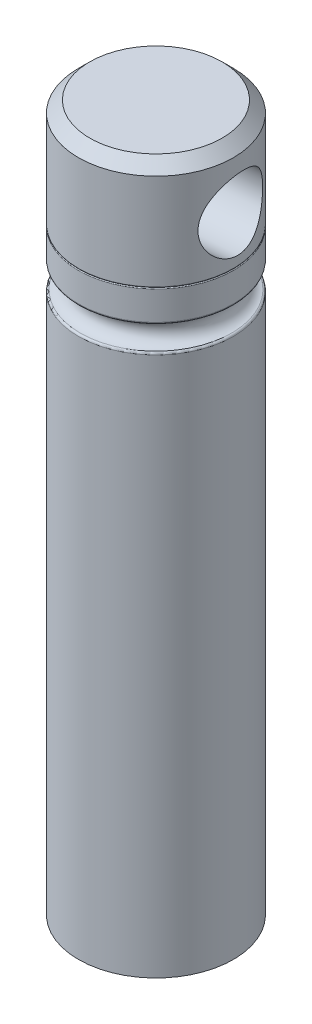
ISO-10303-21;
HEADER;
FILE_DESCRIPTION(('STEP AP214'),'2;1');
FILE_NAME('part.step','',(''),(''),'','','');
FILE_SCHEMA(('AUTOMOTIVE_DESIGN { 1 0 10303 214 1 1 1 1 }'));
ENDSEC;
DATA;
#1=APPLICATION_CONTEXT('core data for automotive mechanical design processes');
#2=APPLICATION_PROTOCOL_DEFINITION('international standard','automotive_design',2000,#1);
#3=PRODUCT_CONTEXT('',#1,'mechanical');
#4=PRODUCT('Part','Part','',(#3));
#5=PRODUCT_RELATED_PRODUCT_CATEGORY('part','',(#4));
#6=PRODUCT_DEFINITION_FORMATION('','',#4);
#7=PRODUCT_DEFINITION_CONTEXT('part definition',#1,'design');
#8=PRODUCT_DEFINITION('design','',#6,#7);
#9=PRODUCT_DEFINITION_SHAPE('','',#8);
#10=(LENGTH_UNIT() NAMED_UNIT(*) SI_UNIT(.MILLI.,.METRE.));
#11=(NAMED_UNIT(*) PLANE_ANGLE_UNIT() SI_UNIT($,.RADIAN.));
#12=(NAMED_UNIT(*) SI_UNIT($,.STERADIAN.) SOLID_ANGLE_UNIT());
#13=UNCERTAINTY_MEASURE_WITH_UNIT(LENGTH_MEASURE(1.E-05),#10,'distance_accuracy_value','');
#14=(GEOMETRIC_REPRESENTATION_CONTEXT(3) GLOBAL_UNCERTAINTY_ASSIGNED_CONTEXT((#13)) GLOBAL_UNIT_ASSIGNED_CONTEXT((#10,
#11,#12)) REPRESENTATION_CONTEXT('',''));
#15=CARTESIAN_POINT('',(0.,0.,0.));
#16=DIRECTION('',(0.,0.,1.));
#17=DIRECTION('',(1.,0.,0.));
#18=AXIS2_PLACEMENT_3D('',#15,#16,#17);
#19=CARTESIAN_POINT('',(-44.632408621397,74.583941633646,75.137205398811));
#20=DIRECTION('',(0.,1.,0.));
#21=DIRECTION('',(0.,0.,1.));
#22=AXIS2_PLACEMENT_3D('',#19,#20,#21);
#23=CYLINDRICAL_SURFACE('',#22,14.2875);
#24=CARTESIAN_POINT('',(-44.632408621397,174.116129254239,75.137205398811));
#25=DIRECTION('',(0.,-1.,0.));
#26=DIRECTION('',(0.,0.,-1.));
#27=AXIS2_PLACEMENT_3D('',#24,#25,#26);
#28=CIRCLE('',#27,14.2875);
#29=CARTESIAN_POINT('',(-44.632408621397,174.116129254239,60.849705398811));
#30=VERTEX_POINT('',#29);
#31=EDGE_CURVE('E10',#30,#30,#28,.T.);
#32=ORIENTED_EDGE('',*,*,#31,.T.);
#33=EDGE_LOOP('',(#32));
#34=FACE_BOUND('',#33,.T.);
#35=CARTESIAN_POINT('',(-44.632408621397,74.583941633646,75.137205398811));
#36=DIRECTION('',(0.,1.,0.));
#37=DIRECTION('',(0.,0.,1.));
#38=AXIS2_PLACEMENT_3D('',#35,#36,#37);
#39=CIRCLE('',#38,14.2875);
#40=CARTESIAN_POINT('',(-44.632408621397,74.583941633646,89.424705398811));
#41=VERTEX_POINT('',#40);
#42=EDGE_CURVE('E157',#41,#41,#39,.T.);
#43=ORIENTED_EDGE('',*,*,#42,.T.);
#44=EDGE_LOOP('',(#43));
#45=FACE_BOUND('',#44,.T.);
#46=ADVANCED_FACE('F44',(#34,#45),#23,.T.);
#47=CARTESIAN_POINT('',(-30.344908621397,74.583941633646,75.137205398811));
#48=DIRECTION('',(0.,-1.,0.));
#49=DIRECTION('',(0.,0.,-1.));
#50=AXIS2_PLACEMENT_3D('',#47,#48,#49);
#51=PLANE('',#50);
#52=ORIENTED_EDGE('',*,*,#42,.F.);
#53=EDGE_LOOP('',(#52));
#54=FACE_BOUND('',#53,.T.);
#55=ADVANCED_FACE('F121',(#54),#51,.T.);
#56=CARTESIAN_POINT('',(-44.632408621397,204.758941633646,75.137205398811));
#57=DIRECTION('',(0.,1.,0.));
#58=DIRECTION('',(0.,0.,1.));
#59=AXIS2_PLACEMENT_3D('',#56,#57,#58);
#60=PLANE('',#59);
#61=CARTESIAN_POINT('',(-44.632408621397,204.758941633646,75.137205398811));
#62=DIRECTION('',(0.,1.,0.));
#63=DIRECTION('',(0.,0.,1.));
#64=AXIS2_PLACEMENT_3D('',#61,#62,#63);
#65=CIRCLE('',#64,12.2047);
#66=CARTESIAN_POINT('',(-44.632408621397,204.758941633646,62.932505398811));
#67=VERTEX_POINT('',#66);
#68=EDGE_CURVE('E71',#67,#67,#65,.T.);
#69=ORIENTED_EDGE('',*,*,#68,.T.);
#70=EDGE_LOOP('',(#69));
#71=FACE_BOUND('',#70,.T.);
#72=ADVANCED_FACE('F117',(#71),#60,.T.);
#73=CARTESIAN_POINT('',(-44.632408621397,74.583941633646,75.137205398811));
#74=DIRECTION('',(0.,1.,0.));
#75=DIRECTION('',(0.,0.,1.));
#76=AXIS2_PLACEMENT_3D('',#73,#74,#75);
#77=CYLINDRICAL_SURFACE('',#76,14.2875);
#78=CARTESIAN_POINT('',(-44.632408621397,202.676141633646,75.137205398811));
#79=DIRECTION('',(0.,1.,0.));
#80=DIRECTION('',(0.,0.,1.));
#81=AXIS2_PLACEMENT_3D('',#78,#79,#80);
#82=CIRCLE('',#81,14.2875);
#83=CARTESIAN_POINT('',(-44.632408621397,202.676141633646,60.849705398811));
#84=VERTEX_POINT('',#83);
#85=EDGE_CURVE('E70',#84,#84,#82,.F.);
#86=ORIENTED_EDGE('',*,*,#85,.T.);
#87=EDGE_LOOP('',(#86));
#88=FACE_BOUND('',#87,.T.);
#89=CARTESIAN_POINT('',(-57.8378321223061,193.163841633646,69.6829000890912));
#90=CARTESIAN_POINT('',(-57.8378335835206,192.991804531908,69.6829015806785));
#91=CARTESIAN_POINT('',(-57.8407663318358,192.819726553803,69.6899873856762));
#92=CARTESIAN_POINT('',(-57.8523836249683,192.476854181424,69.7182440022443));
#93=CARTESIAN_POINT('',(-57.8610714471332,192.306060574644,69.7394228394186));
#94=CARTESIAN_POINT('',(-57.8838722131254,191.96680564734,69.7956430102752));
#95=CARTESIAN_POINT('',(-57.8979953966299,191.798349354445,69.8307105124648));
#96=CARTESIAN_POINT('',(-57.9311227998924,191.46523301938,69.9142872033787));
#97=CARTESIAN_POINT('',(-57.950129101787,191.300574629335,69.9628021267116));
#98=CARTESIAN_POINT('',(-57.9922110213457,190.977000668519,70.0724486409913));
#99=CARTESIAN_POINT('',(-58.0152654029837,190.818060103419,70.133514661469));
#100=CARTESIAN_POINT('',(-58.0647132838279,190.5059207251,70.2678144625371));
#101=CARTESIAN_POINT('',(-58.0911080635049,190.352724143061,70.3410529125617));
#102=CARTESIAN_POINT('',(-58.1739958466926,189.90313953777,70.5780316757338));
#103=CARTESIAN_POINT('',(-58.2342424523975,189.616395726314,70.7591590920201));
#104=CARTESIAN_POINT('',(-58.3617363243774,189.056010043142,71.1762808118769));
#105=CARTESIAN_POINT('',(-58.4291810493789,188.784585263797,71.4151686797892));
#106=CARTESIAN_POINT('',(-58.5588758264525,188.282779949622,71.9344598785913));
#107=CARTESIAN_POINT('',(-58.6211236248826,188.052417172642,72.2148810756436));
#108=CARTESIAN_POINT('',(-58.7061157691024,187.736599881217,72.6696008435242));
#109=CARTESIAN_POINT('',(-58.7336284463258,187.634105539291,72.8314378869739));
#110=CARTESIAN_POINT('',(-58.7839601202564,187.442990884666,73.1637746709655));
#111=CARTESIAN_POINT('',(-58.8067810793209,187.354364775161,73.3342707524166));
#112=CARTESIAN_POINT('',(-58.8467654202131,187.191824494734,73.6827367525224));
#113=CARTESIAN_POINT('',(-58.86392979994,187.117907729792,73.86070534667));
#114=CARTESIAN_POINT('',(-58.8917733346369,186.985556364445,74.2228046990767));
#115=CARTESIAN_POINT('',(-58.9024530465349,186.92712043473,74.4069349267178));
#116=CARTESIAN_POINT('',(-58.9162250574596,186.829497475738,74.7684840403913));
#117=CARTESIAN_POINT('',(-58.9197396315263,186.789355281672,74.9456292163356));
#118=CARTESIAN_POINT('',(-58.9200656495892,186.723805932131,75.3026356358761));
#119=CARTESIAN_POINT('',(-58.9168773428789,186.698398228696,75.482496778213));
#120=CARTESIAN_POINT('',(-58.903588014353,186.662637959615,75.8433824130527));
#121=CARTESIAN_POINT('',(-58.8934898755271,186.652279120756,76.0244063891943));
#122=CARTESIAN_POINT('',(-58.8663698478936,186.646729222079,76.3861642872435));
#123=CARTESIAN_POINT('',(-58.8493482936756,186.651537429355,76.5668982227443));
#124=CARTESIAN_POINT('',(-58.8100612314926,186.675353773977,76.9134330882747));
#125=CARTESIAN_POINT('',(-58.788268638597,186.693300853208,77.0793618868896));
#126=CARTESIAN_POINT('',(-58.7391899117622,186.74198807467,77.4085666005077));
#127=CARTESIAN_POINT('',(-58.711901893005,186.772732610036,77.5718415844864));
#128=CARTESIAN_POINT('',(-58.6522768351667,186.846686758611,77.8945350378626));
#129=CARTESIAN_POINT('',(-58.6199415280958,186.889892100109,78.0539548086082));
#130=CARTESIAN_POINT('',(-58.550743470542,186.988373028096,78.36807095765));
#131=CARTESIAN_POINT('',(-58.5138789943433,187.043653221656,78.5227655073241));
#132=CARTESIAN_POINT('',(-58.435688680623,187.166691740752,78.8287367492457));
#133=CARTESIAN_POINT('',(-58.3943052767373,187.234621389959,78.979929887979));
#134=CARTESIAN_POINT('',(-58.3082654278906,187.381847987582,79.2757283059685));
#135=CARTESIAN_POINT('',(-58.2636077959404,187.461149068482,79.4203311649696));
#136=CARTESIAN_POINT('',(-58.12589924024,187.715259094766,79.8431586995966));
#137=CARTESIAN_POINT('',(-58.0290634300777,187.906350707055,80.1105895270472));
#138=CARTESIAN_POINT('',(-57.8241894071966,188.3442927162,80.6321657240858));
#139=CARTESIAN_POINT('',(-57.7158835220941,188.594429391578,80.8834259178644));
#140=CARTESIAN_POINT('',(-57.504682836917,189.1346340421,81.3421234424278));
#141=CARTESIAN_POINT('',(-57.401791032756,189.424723810957,81.5495366978661));
#142=CARTESIAN_POINT('',(-57.256752925189,189.891987193613,81.8282651970351));
#143=CARTESIAN_POINT('',(-57.2090232193611,190.05709976339,81.9173374754889));
#144=CARTESIAN_POINT('',(-57.1191293151585,190.395557294418,82.081498594936));
#145=CARTESIAN_POINT('',(-57.0769626418902,190.568898547884,82.1565936602912));
#146=CARTESIAN_POINT('',(-56.9995497897723,190.922623601752,82.2921039569544));
#147=CARTESIAN_POINT('',(-56.9643003548598,191.103004040518,82.3525260982562));
#148=CARTESIAN_POINT('',(-56.9019244185428,191.469552035492,82.4580937139798));
#149=CARTESIAN_POINT('',(-56.87479701738,191.65571894815,82.5032408806345));
#150=CARTESIAN_POINT('',(-56.8313286262123,192.018551402305,82.5749896569441));
#151=CARTESIAN_POINT('',(-56.8143456121743,192.194920585858,82.6027030633649));
#152=CARTESIAN_POINT('',(-56.7888191763928,192.549897735736,82.6441979661705));
#153=CARTESIAN_POINT('',(-56.7802753331049,192.728505589785,82.657980158433));
#154=CARTESIAN_POINT('',(-56.7719340297686,193.08638208868,82.6714367502891));
#155=CARTESIAN_POINT('',(-56.7721329716831,193.265650431334,82.6711169534654));
#156=CARTESIAN_POINT('',(-56.7812616899731,193.623378239922,82.6563876118696));
#157=CARTESIAN_POINT('',(-56.790191080925,193.801837741215,82.6419786890905));
#158=CARTESIAN_POINT('',(-56.8153594206304,194.141612096004,82.6010437922979));
#159=CARTESIAN_POINT('',(-56.8309249168937,194.303113044332,82.5756314515427));
#160=CARTESIAN_POINT('',(-56.8686714538393,194.623163545075,82.5133732985422));
#161=CARTESIAN_POINT('',(-56.8908547332962,194.781712079383,82.4765236169108));
#162=CARTESIAN_POINT('',(-56.9412223854179,195.094800776653,82.3917340791963));
#163=CARTESIAN_POINT('',(-56.9694057067348,195.24934163654,82.343796165904));
#164=CARTESIAN_POINT('',(-57.0310617745723,195.553648410593,82.2371946661077));
#165=CARTESIAN_POINT('',(-57.0645365676525,195.703412450205,82.178526928292));
#166=CARTESIAN_POINT('',(-57.1375848091394,196.004007010802,82.0479983201235));
#167=CARTESIAN_POINT('',(-57.1773651621583,196.15458123747,81.9756619156883));
#168=CARTESIAN_POINT('',(-57.2608644252122,196.448919629798,81.8202109309626));
#169=CARTESIAN_POINT('',(-57.3045846695242,196.592681463043,81.7370926950952));
#170=CARTESIAN_POINT('',(-57.4402291224257,197.012836744656,81.4721596887833));
#171=CARTESIAN_POINT('',(-57.5366717883352,197.278237128446,81.2747068305273));
#172=CARTESIAN_POINT('',(-57.6893156934361,197.662678193485,80.9395336699992));
#173=CARTESIAN_POINT('',(-57.7441454322665,197.793935422278,80.8147924418528));
#174=CARTESIAN_POINT('',(-57.8538181661762,198.045238925375,80.5544832954873));
#175=CARTESIAN_POINT('',(-57.9086611526138,198.165288485586,80.4189185723026));
#176=CARTESIAN_POINT('',(-58.0171798089791,198.393469926051,80.1375367351112));
#177=CARTESIAN_POINT('',(-58.0708547727583,198.501594749325,79.9917136329762));
#178=CARTESIAN_POINT('',(-58.175820753603,198.705039846081,79.690669771777));
#179=CARTESIAN_POINT('',(-58.2271127914883,198.800365636235,79.5354531036741));
#180=CARTESIAN_POINT('',(-58.3268272644429,198.978551463463,79.2144756762687));
#181=CARTESIAN_POINT('',(-58.3752073631627,199.061246332849,79.0486098863596));
#182=CARTESIAN_POINT('',(-58.4673155970253,199.211930836686,78.7091672912443));
#183=CARTESIAN_POINT('',(-58.5110457471899,199.279926854082,78.535593872691));
#184=CARTESIAN_POINT('',(-58.5928921675587,199.400490273929,78.1819516664487));
#185=CARTESIAN_POINT('',(-58.6310104956521,199.453063339125,78.0018852900739));
#186=CARTESIAN_POINT('',(-58.7008192715132,199.54216898757,77.6366128445968));
#187=CARTESIAN_POINT('',(-58.7325103245413,199.578703081595,77.4514072613259));
#188=CARTESIAN_POINT('',(-58.7865441321797,199.632971503016,77.0925392772916));
#189=CARTESIAN_POINT('',(-58.8094349846551,199.651985280956,76.9191518287436));
#190=CARTESIAN_POINT('',(-58.8488956951189,199.675835677963,76.5706935747965));
#191=CARTESIAN_POINT('',(-58.8654659117115,199.680673101435,76.3956228654759));
#192=CARTESIAN_POINT('',(-58.8921088285133,199.676114124352,76.0452124503254));
#193=CARTESIAN_POINT('',(-58.902182910567,199.666720752368,75.8698728096618));
#194=CARTESIAN_POINT('',(-58.9158436568524,199.633817955194,75.520271945583));
#195=CARTESIAN_POINT('',(-58.9194304137809,199.610308731709,75.3460107067942));
#196=CARTESIAN_POINT('',(-58.9202762045719,199.550932632595,75.0083520908988));
#197=CARTESIAN_POINT('',(-58.9178349956467,199.51572358548,74.8448390434646));
#198=CARTESIAN_POINT('',(-58.9075354821455,199.433116892394,74.5210433208895));
#199=CARTESIAN_POINT('',(-58.899675423142,199.385715302037,74.3607617092737));
#200=CARTESIAN_POINT('',(-58.8789459289298,199.279179554551,74.0445315896587));
#201=CARTESIAN_POINT('',(-58.8660777408554,199.220048320158,73.8885820132377));
#202=CARTESIAN_POINT('',(-58.8358312846104,199.090518918255,73.5818252268585));
#203=CARTESIAN_POINT('',(-58.818451293118,199.020116449546,73.4310200067876));
#204=CARTESIAN_POINT('',(-58.7788898327266,198.865154074854,73.1287224291574));
#205=CARTESIAN_POINT('',(-58.7565264431902,198.780097118692,72.9775087280326));
#206=CARTESIAN_POINT('',(-58.7082433354187,198.598859732904,72.6824354715889));
#207=CARTESIAN_POINT('',(-58.6823223971708,198.50267548911,72.5385784624783));
#208=CARTESIAN_POINT('',(-58.6277223622453,198.299803499766,72.2589866592912));
#209=CARTESIAN_POINT('',(-58.599042724934,198.193113695299,72.1232534657623));
#210=CARTESIAN_POINT('',(-58.5397721545509,197.969849415052,71.8606183445615));
#211=CARTESIAN_POINT('',(-58.5091811239219,197.853274434624,71.7337168683598));
#212=CARTESIAN_POINT('',(-58.4443673195201,197.600702965392,71.4791855816825));
#213=CARTESIAN_POINT('',(-58.4100545955714,197.463897570933,71.3523799112379));
#214=CARTESIAN_POINT('',(-58.3413849472956,197.180178337662,71.1107429303083));
#215=CARTESIAN_POINT('',(-58.3070280398366,197.033267625148,70.9959079438442));
#216=CARTESIAN_POINT('',(-58.2394048228284,196.729906516352,70.7788514379016));
#217=CARTESIAN_POINT('',(-58.2061397553679,196.573445797389,70.6766439416657));
#218=CARTESIAN_POINT('',(-58.1419532799225,196.252051277669,70.485862699987));
#219=CARTESIAN_POINT('',(-58.1110308255316,196.087121315881,70.3972828488594));
#220=CARTESIAN_POINT('',(-58.0524243869138,195.748131800084,70.2337934052012));
#221=CARTESIAN_POINT('',(-58.0247727934648,195.574002246199,70.1590169943737));
#222=CARTESIAN_POINT('',(-57.9742036578317,195.219271482031,70.0250342249092));
#223=CARTESIAN_POINT('',(-57.951283726616,195.038673591952,69.9658200047281));
#224=CARTESIAN_POINT('',(-57.9112318844911,194.672782710602,69.8638281577939));
#225=CARTESIAN_POINT('',(-57.8940848358583,194.487503390133,69.8210075025009));
#226=CARTESIAN_POINT('',(-57.8663127888874,194.113454348342,69.7522423660725));
#227=CARTESIAN_POINT('',(-57.8556829601853,193.924687319162,69.7262853852449));
#228=CARTESIAN_POINT('',(-57.844999703188,193.640157340234,69.7002793434819));
#229=CARTESIAN_POINT('',(-57.8423155088834,193.545038660207,69.6937655503592));
#230=CARTESIAN_POINT('',(-57.8387312805122,193.354564724143,69.6850754297004));
#231=CARTESIAN_POINT('',(-57.8378313122899,193.259209459505,69.682899262238));
#232=CARTESIAN_POINT('',(-57.8378321223061,193.163841633646,69.6829000890912));
#233=B_SPLINE_CURVE_WITH_KNOTS('',3,(#89,#90,#91,#92,#93,#94,#95,#96,#97,#98,#99,#100,#101,#102,
#103,#104,#105,#106,#107,#108,#109,#110,#111,#112,#113,#114,#115,#116,#117,#118,#119,#120,#121,
#122,#123,#124,#125,#126,#127,#128,#129,#130,#131,#132,#133,#134,#135,#136,#137,#138,#139,#140,
#141,#142,#143,#144,#145,#146,#147,#148,#149,#150,#151,#152,#153,#154,#155,#156,#157,#158,#159,
#160,#161,#162,#163,#164,#165,#166,#167,#168,#169,#170,#171,#172,#173,#174,#175,#176,#177,#178,
#179,#180,#181,#182,#183,#184,#185,#186,#187,#188,#189,#190,#191,#192,#193,#194,#195,#196,#197,
#198,#199,#200,#201,#202,#203,#204,#205,#206,#207,#208,#209,#210,#211,#212,#213,#214,#215,#216,
#217,#218,#219,#220,#221,#222,#223,#224,#225,#226,#227,#228,#229,#230,#231,#232),.UNSPECIFIED.,
.T.,.F.,(4,2,2,2,2,2,2,2,2,2,2,2,2,2,2,2,2,2,2,2,2,2,2,2,2,2,2,2,2,2,2,2,2,2,2,2,2,2,2,2,2,2,2,
2,2,2,2,2,2,2,2,2,2,2,2,2,2,2,2,2,2,2,2,2,2,2,2,2,2,2,2,4),(0.,0.516012682824647,
1.03231947280172,1.54960373248221,2.067108926628,2.58197628133222,3.09704160076474,
4.1260307715166,5.22499628330024,6.3244359114238,6.90439942647955,7.48411987034073,
8.06373798864627,8.64330632009817,9.1875963984953,9.73186623402012,10.2759091221602,
10.8199257213403,11.3242714470438,11.8287904484585,12.3331366999291,12.8376757181611,
13.3496240514666,13.8617589053068,14.8854117360487,15.9929604417471,17.1011157064754,
17.6812346000657,18.2610945325395,18.8406808567813,19.4202029507119,19.957489692651,
20.4947495952604,21.031788394079,21.5688034852964,22.0609261707134,22.5532155287976,
23.0454186971487,23.5378127006712,24.0524046120888,24.5671714540177,25.5962489477835,
26.163338062496,26.7302603903003,27.2975164387836,27.8645271968212,28.4384131924746,
29.0120494764613,29.5854748777464,30.1588462541186,30.6859360150565,31.2129958668721,
31.7399435665813,32.2668837367373,32.7681527737099,33.2695841796944,33.7708907980351,
34.2723891771822,34.7966177150047,35.3210264811847,35.8455382281511,36.3700767680715,
36.9384185596149,37.5065853063974,38.0753774551712,38.643914017361,39.2176780660231,
39.7911517070118,40.3631096478669,40.9346431569236,41.2206814080896,41.5067302148844),.UNSPECIFIED.);
#234=CARTESIAN_POINT('',(-57.8378321223061,193.163841633646,69.6829000890912));
#235=VERTEX_POINT('',#234);
#236=EDGE_CURVE('E76',#235,#235,#233,.T.);
#237=ORIENTED_EDGE('',*,*,#236,.F.);
#238=EDGE_LOOP('',(#237));
#239=FACE_BOUND('',#238,.T.);
#240=CARTESIAN_POINT('',(-32.4917010743628,193.163841633646,67.6048832796113));
#241=CARTESIAN_POINT('',(-32.4916993897163,193.335878735384,67.6048845132833));
#242=CARTESIAN_POINT('',(-32.4876516939644,193.507956713489,67.6113980226481));
#243=CARTESIAN_POINT('',(-32.4715871984371,193.850829085868,67.6373851322038));
#244=CARTESIAN_POINT('',(-32.4595658578974,194.021622692648,67.6568661170263));
#245=CARTESIAN_POINT('',(-32.4279126270021,194.360877619952,67.7086218463213));
#246=CARTESIAN_POINT('',(-32.4082663714743,194.529333912847,67.7409207420588));
#247=CARTESIAN_POINT('',(-32.3619686705474,194.862450247912,67.8179857211343));
#248=CARTESIAN_POINT('',(-32.3353142367836,195.027108637957,67.8627571233731));
#249=CARTESIAN_POINT('',(-32.2759354366066,195.350682598773,67.9640853234805));
#250=CARTESIAN_POINT('',(-32.2432427025216,195.509623163873,68.0205808853215));
#251=CARTESIAN_POINT('',(-32.172580865603,195.821762542192,68.1450334236251));
#252=CARTESIAN_POINT('',(-32.1346097388571,195.974959124231,68.2129947986101));
#253=CARTESIAN_POINT('',(-32.0142305670625,196.424543729522,68.4333086061538));
#254=CARTESIAN_POINT('',(-31.9252870960257,196.711287540978,68.6022045900889));
#255=CARTESIAN_POINT('',(-31.7315564595135,197.27167322415,68.9929905379495));
#256=CARTESIAN_POINT('',(-31.6261031789377,197.543098003495,69.217703265631));
#257=CARTESIAN_POINT('',(-31.4135600373618,198.04490331767,69.7089358961865));
#258=CARTESIAN_POINT('',(-31.3064694899345,198.27526609465,69.9754737937121));
#259=CARTESIAN_POINT('',(-31.1485492019622,198.591083386075,70.4102782492173));
#260=CARTESIAN_POINT('',(-31.0950444917792,198.693577728001,70.5654730365936));
#261=CARTESIAN_POINT('',(-30.9912551265207,198.884692382626,70.8851741205045));
#262=CARTESIAN_POINT('',(-30.9409691312714,198.973318492131,71.0496764871883));
#263=CARTESIAN_POINT('',(-30.8447618583345,199.135858772558,71.3869767412357));
#264=CARTESIAN_POINT('',(-30.798839811804,199.2097755375,71.5597731592447));
#265=CARTESIAN_POINT('',(-30.7123906723265,199.342126902847,71.9125021624771));
#266=CARTESIAN_POINT('',(-30.6718631163138,199.400562832561,72.0924341334578));
#267=CARTESIAN_POINT('',(-30.5993872172755,199.498185791554,72.4469121637243));
#268=CARTESIAN_POINT('',(-30.5670668189576,199.53832798562,72.6211193893029));
#269=CARTESIAN_POINT('',(-30.508597258963,199.603877335161,72.9733054203077));
#270=CARTESIAN_POINT('',(-30.4824478678146,199.629285038596,73.1512840852229));
#271=CARTESIAN_POINT('',(-30.4367800094245,199.665045307677,73.5095151480809));
#272=CARTESIAN_POINT('',(-30.417258781794,199.675404146536,73.6897665669869));
#273=CARTESIAN_POINT('',(-30.3850948631363,199.680954045213,74.0511109387936));
#274=CARTESIAN_POINT('',(-30.3724518397736,199.676145837937,74.2322038506093));
#275=CARTESIAN_POINT('',(-30.3547719547468,199.652329493315,74.5805101927115));
#276=CARTESIAN_POINT('',(-30.3492476663225,199.634382414084,74.7477727574183));
#277=CARTESIAN_POINT('',(-30.3440513644225,199.585695192622,75.0805751963257));
#278=CARTESIAN_POINT('',(-30.3443813622377,199.554950657256,75.2461144589263));
#279=CARTESIAN_POINT('',(-30.3506510910029,199.480996508681,75.5742103334436));
#280=CARTESIAN_POINT('',(-30.3565889011123,199.437791167183,75.7367679472273));
#281=CARTESIAN_POINT('',(-30.3737008363209,199.339310239196,76.0579602695694));
#282=CARTESIAN_POINT('',(-30.3848769619307,199.284030045636,76.2165934550024));
#283=CARTESIAN_POINT('',(-30.4121876877257,199.16099152654,76.531214258986));
#284=CARTESIAN_POINT('',(-30.4283926944518,199.093061877333,76.6871288159529));
#285=CARTESIAN_POINT('',(-30.4651050487751,198.94583527971,76.9929911423593));
#286=CARTESIAN_POINT('',(-30.4856139617132,198.86653419881,77.142936717195));
#287=CARTESIAN_POINT('',(-30.5526150280979,198.612424172526,77.5825474853241));
#288=CARTESIAN_POINT('',(-30.6045995888252,198.421332560237,77.8621794345837));
#289=CARTESIAN_POINT('',(-30.7217854080889,197.983390551092,78.4101598889178));
#290=CARTESIAN_POINT('',(-30.7877206914913,197.733253875714,78.6757053428954));
#291=CARTESIAN_POINT('',(-30.9213901373292,197.193049225192,79.1626772391166));
#292=CARTESIAN_POINT('',(-30.9891252651611,196.902959456335,79.3840794395406));
#293=CARTESIAN_POINT('',(-31.0868283302444,196.435696073679,79.6827092102751));
#294=CARTESIAN_POINT('',(-31.1194129112633,196.270583503902,79.7783661007075));
#295=CARTESIAN_POINT('',(-31.1813684558684,195.932125972874,79.9549766826203));
#296=CARTESIAN_POINT('',(-31.2107408474986,195.758784719408,80.0359369184472));
#297=CARTESIAN_POINT('',(-31.2650485467097,195.40505966554,80.1822463985952));
#298=CARTESIAN_POINT('',(-31.2899859413994,195.224679226774,80.247602990973));
#299=CARTESIAN_POINT('',(-31.334334474361,194.8581312318,80.3619204723358));
#300=CARTESIAN_POINT('',(-31.3537462247517,194.671964319142,80.4108831775058));
#301=CARTESIAN_POINT('',(-31.3849479830604,194.309131864987,80.4887538280172));
#302=CARTESIAN_POINT('',(-31.3971903563619,194.132762681434,80.5188632942564));
#303=CARTESIAN_POINT('',(-31.4156173872066,193.777785531556,80.5639617467442));
#304=CARTESIAN_POINT('',(-31.4218023473233,193.599177677507,80.5789514882378));
#305=CARTESIAN_POINT('',(-31.4278405047064,193.241301178612,80.5935869882685));
#306=CARTESIAN_POINT('',(-31.4276963066972,193.062032835958,80.5932390589252));
#307=CARTESIAN_POINT('',(-31.4210885499186,192.70430502737,80.5772195535701));
#308=CARTESIAN_POINT('',(-31.4146252701181,192.525845526077,80.5615486540221));
#309=CARTESIAN_POINT('',(-31.3964603417866,192.186071171288,80.5170610548773));
#310=CARTESIAN_POINT('',(-31.3852417682948,192.02457022296,80.489452807099));
#311=CARTESIAN_POINT('',(-31.3581396594903,191.704519722217,80.4218780014037));
#312=CARTESIAN_POINT('',(-31.3422545455299,191.54597118791,80.381907261127));
#313=CARTESIAN_POINT('',(-31.3063696869587,191.232882490639,80.290046262812));
#314=CARTESIAN_POINT('',(-31.2863706632221,191.078341630752,80.2381580928612));
#315=CARTESIAN_POINT('',(-31.2429007812143,190.774034856699,80.1229377829404));
#316=CARTESIAN_POINT('',(-31.2194285798627,190.624270817087,80.0596012137573));
#317=CARTESIAN_POINT('',(-31.1686158092822,190.32367625649,79.9189177908509));
#318=CARTESIAN_POINT('',(-31.1411485515895,190.173102029822,79.8410680532293));
#319=CARTESIAN_POINT('',(-31.0840835824668,189.878763637495,79.6740928308705));
#320=CARTESIAN_POINT('',(-31.0544851499838,189.735001804249,79.5849635220492));
#321=CARTESIAN_POINT('',(-30.9638033420801,189.314846522636,79.3014750299517));
#322=CARTESIAN_POINT('',(-30.9008089209447,189.049446138846,79.0909506324415));
#323=CARTESIAN_POINT('',(-30.8047951216948,188.665005073807,78.7353911301688));
#324=CARTESIAN_POINT('',(-30.7710149456399,188.533747845014,78.6033851683133));
#325=CARTESIAN_POINT('',(-30.7052049258442,188.282444341917,78.3286889696879));
#326=CARTESIAN_POINT('',(-30.6731745702343,188.162394781706,78.1860018866949));
#327=CARTESIAN_POINT('',(-30.6119354595457,187.934213341241,77.8907023634942));
#328=CARTESIAN_POINT('',(-30.5827283765103,187.826088517967,77.7380841301354));
#329=CARTESIAN_POINT('',(-30.5281969789746,187.622643421211,77.423963786663));
#330=CARTESIAN_POINT('',(-30.5028709909652,187.527317631057,77.2624655466146));
#331=CARTESIAN_POINT('',(-30.4567676813777,187.349131803829,76.9295331662947));
#332=CARTESIAN_POINT('',(-30.4360492378102,187.266436934443,76.7580022935328));
#333=CARTESIAN_POINT('',(-30.4004581360941,187.115752430606,76.4080901965677));
#334=CARTESIAN_POINT('',(-30.3855829382256,187.04775641321,76.2297119855943));
#335=CARTESIAN_POINT('',(-30.3624293993479,186.927192993363,75.8674612986377));
#336=CARTESIAN_POINT('',(-30.3541486351835,186.874619928167,75.6835908665877));
#337=CARTESIAN_POINT('',(-30.344766286721,186.785514279722,75.3118258922432));
#338=CARTESIAN_POINT('',(-30.3436640261144,186.748980185697,75.1239317307099));
#339=CARTESIAN_POINT('',(-30.3488028595421,186.694711764276,74.7610550647148));
#340=CARTESIAN_POINT('',(-30.3544583915325,186.675697986336,74.5862545687231));
#341=CARTESIAN_POINT('',(-30.3722802215386,186.651847589329,74.2360222389913));
#342=CARTESIAN_POINT('',(-30.3844461500899,186.647010165857,74.0605904416385));
#343=CARTESIAN_POINT('',(-30.4152325721064,186.65156914294,73.7105197340934));
#344=CARTESIAN_POINT('',(-30.4338516915655,186.660962514924,73.5358806631275));
#345=CARTESIAN_POINT('',(-30.477315069879,186.693865312098,73.1887231845976));
#346=CARTESIAN_POINT('',(-30.5021592397787,186.717374535583,73.0162047467671));
#347=CARTESIAN_POINT('',(-30.5563213394256,186.776750634697,72.6829172984401));
#348=CARTESIAN_POINT('',(-30.5853623547291,186.811959681812,72.5219853388659));
#349=CARTESIAN_POINT('',(-30.6482629925757,186.894566374898,72.2041909718693));
#350=CARTESIAN_POINT('',(-30.6821241728953,186.941967965255,72.0473298995249));
#351=CARTESIAN_POINT('',(-30.7540832569822,187.048503712741,71.7386989051329));
#352=CARTESIAN_POINT('',(-30.7921801042894,187.107634947134,71.5869277258021));
#353=CARTESIAN_POINT('',(-30.8719860838343,187.237164349037,71.2891936502683));
#354=CARTESIAN_POINT('',(-30.9136965922759,187.307566817746,71.143232998069));
#355=CARTESIAN_POINT('',(-31.0019668884332,187.462529192438,70.8514157788963));
#356=CARTESIAN_POINT('',(-31.0486607809705,187.5475861486,70.7058637778824));
#357=CARTESIAN_POINT('',(-31.1443595890021,187.728823534388,70.4225949597861));
#358=CARTESIAN_POINT('',(-31.1933652935008,187.825007778182,70.2848808536224));
#359=CARTESIAN_POINT('',(-31.292775113262,188.027879767526,70.017915634992));
#360=CARTESIAN_POINT('',(-31.3431795012475,188.134569571993,69.8886661897566));
#361=CARTESIAN_POINT('',(-31.4444356463043,188.35783385224,69.6391919416067));
#362=CARTESIAN_POINT('',(-31.4952874260963,188.474408832668,69.5189676000235));
#363=CARTESIAN_POINT('',(-31.6006928607282,188.7269803019,69.2783918333955));
#364=CARTESIAN_POINT('',(-31.6552010316899,188.863785696359,69.1588681939759));
#365=CARTESIAN_POINT('',(-31.762310643957,189.14750492963,68.9316425745861));
#366=CARTESIAN_POINT('',(-31.8149126673494,189.294415642144,68.8239369649764));
#367=CARTESIAN_POINT('',(-31.91698624432,189.597776750941,68.6207931461314));
#368=CARTESIAN_POINT('',(-31.9664542883416,189.754237469903,68.5253685705723));
#369=CARTESIAN_POINT('',(-32.0608573976896,190.075631989623,68.3475893851989));
#370=CARTESIAN_POINT('',(-32.1057944899204,190.240561951411,68.265228921667));
#371=CARTESIAN_POINT('',(-32.1902468876027,190.579551467208,68.113468237164));
#372=CARTESIAN_POINT('',(-32.2297085426597,190.753681021093,68.044194143762));
#373=CARTESIAN_POINT('',(-32.3014250247389,191.108411785261,67.9202370294432));
#374=CARTESIAN_POINT('',(-32.3336834893501,191.28900967534,67.8655466410781));
#375=CARTESIAN_POINT('',(-32.3898125566226,191.65490055669,67.7714402400963));
#376=CARTESIAN_POINT('',(-32.4137051031965,191.840179877159,67.7319842390983));
#377=CARTESIAN_POINT('',(-32.4523065089856,192.21422891895,67.6686607675251));
#378=CARTESIAN_POINT('',(-32.4670221699662,192.40299594813,67.6447817509242));
#379=CARTESIAN_POINT('',(-32.4817985366521,192.687525927058,67.6208630307283));
#380=CARTESIAN_POINT('',(-32.4855078302663,192.782644607085,67.6148734113086));
#381=CARTESIAN_POINT('',(-32.4904596115775,192.973118543149,67.6068831202045));
#382=CARTESIAN_POINT('',(-32.4917020082373,193.068473807787,67.6048825957319));
#383=CARTESIAN_POINT('',(-32.4917010743628,193.163841633646,67.6048832796113));
#384=B_SPLINE_CURVE_WITH_KNOTS('',3,(#240,#241,#242,#243,#244,#245,#246,#247,#248,#249,#250,
#251,#252,#253,#254,#255,#256,#257,#258,#259,#260,#261,#262,#263,#264,#265,#266,#267,#268,#269,
#270,#271,#272,#273,#274,#275,#276,#277,#278,#279,#280,#281,#282,#283,#284,#285,#286,#287,#288,
#289,#290,#291,#292,#293,#294,#295,#296,#297,#298,#299,#300,#301,#302,#303,#304,#305,#306,#307,
#308,#309,#310,#311,#312,#313,#314,#315,#316,#317,#318,#319,#320,#321,#322,#323,#324,#325,#326,
#327,#328,#329,#330,#331,#332,#333,#334,#335,#336,#337,#338,#339,#340,#341,#342,#343,#344,#345,
#346,#347,#348,#349,#350,#351,#352,#353,#354,#355,#356,#357,#358,#359,#360,#361,#362,#363,#364,
#365,#366,#367,#368,#369,#370,#371,#372,#373,#374,#375,#376,#377,#378,#379,#380,#381,#382,#383),
.UNSPECIFIED.,.T.,.F.,(4,2,2,2,2,2,2,2,2,2,2,2,2,2,2,2,2,2,2,2,2,2,2,2,2,2,2,2,2,2,2,2,2,2,2,2,
2,2,2,2,2,2,2,2,2,2,2,2,2,2,2,2,2,2,2,2,2,2,2,2,2,2,2,2,2,2,2,2,2,2,2,4),(0.,0.516012682824646,
1.03231947280172,1.54960373248221,2.067108926628,2.58197628133222,3.09704160076474,
4.12603077151659,5.22499628330022,6.3244359114238,6.90439942647954,7.48411987034072,
8.06373798864628,8.64330632009815,9.1875963984953,9.73186623402009,10.2759091221602,
10.8199257213403,11.3242714470438,11.8287904484585,12.3331366999291,12.8376757181611,
13.3496240514666,13.8617589053068,14.8854117360487,15.9929604417471,17.1011157064754,
17.6812346000657,18.2610945325395,18.8406808567813,19.4202029507119,19.957489692651,
20.4947495952604,21.031788394079,21.5688034852964,22.0609261707134,22.5532155287975,
23.0454186971487,23.5378127006712,24.0524046120888,24.5671714540176,25.5962489477835,
26.163338062496,26.7302603903003,27.2975164387836,27.8645271968212,28.4384131924747,
29.0120494764613,29.5854748777464,30.1588462541185,30.6859360150565,31.2129958668721,
31.7399435665812,32.2668837367373,32.76815277371,33.2695841796944,33.7708907980351,
34.2723891771822,34.7966177150047,35.3210264811847,35.8455382281511,36.3700767680714,
36.9384185596149,37.5065853063974,38.0753774551712,38.643914017361,39.2176780660231,
39.7911517070118,40.3631096478669,40.9346431569236,41.2206814080896,41.5067302148844),.UNSPECIFIED.);
#385=CARTESIAN_POINT('',(-32.4917010743628,193.163841633646,67.6048832796113));
#386=VERTEX_POINT('',#385);
#387=EDGE_CURVE('E80',#386,#386,#384,.T.);
#388=ORIENTED_EDGE('',*,*,#387,.F.);
#389=EDGE_LOOP('',(#388));
#390=FACE_BOUND('',#389,.T.);
#391=CARTESIAN_POINT('',(-44.632408621397,184.997741633646,75.137205398811));
#392=DIRECTION('',(0.,1.,0.));
#393=DIRECTION('',(0.,0.,1.));
#394=AXIS2_PLACEMENT_3D('',#391,#392,#393);
#395=CIRCLE('',#394,14.2875);
#396=CARTESIAN_POINT('',(-44.632408621397,184.997741633646,89.424705398811));
#397=VERTEX_POINT('',#396);
#398=EDGE_CURVE('E152',#397,#397,#395,.T.);
#399=ORIENTED_EDGE('',*,*,#398,.T.);
#400=EDGE_LOOP('',(#399));
#401=FACE_BOUND('',#400,.T.);
#402=ADVANCED_FACE('F95',(#88,#239,#390,#401),#77,.T.);
#403=CARTESIAN_POINT('',(-44.632408621397,184.997741633646,75.137205398811));
#404=DIRECTION('',(0.,1.,0.));
#405=DIRECTION('',(0.,0.,1.));
#406=AXIS2_PLACEMENT_3D('',#403,#404,#405);
#407=TOROIDAL_SURFACE('',#406,14.1097,0.177800000000002);
#408=CARTESIAN_POINT('',(-44.632408621397,184.819941633646,75.137205398811));
#409=DIRECTION('',(0.,1.,0.));
#410=DIRECTION('',(0.,0.,1.));
#411=AXIS2_PLACEMENT_3D('',#408,#409,#410);
#412=CIRCLE('',#411,14.1097);
#413=CARTESIAN_POINT('',(-44.632408621397,184.819941633646,89.246905398811));
#414=VERTEX_POINT('',#413);
#415=EDGE_CURVE('E151',#414,#414,#412,.T.);
#416=ORIENTED_EDGE('',*,*,#415,.T.);
#417=EDGE_LOOP('',(#416));
#418=FACE_BOUND('',#417,.T.);
#419=ORIENTED_EDGE('',*,*,#398,.F.);
#420=EDGE_LOOP('',(#419));
#421=FACE_BOUND('',#420,.T.);
#422=ADVANCED_FACE('F115',(#418,#421),#407,.T.);
#423=CARTESIAN_POINT('',(-44.632408621397,184.642141633646,75.137205398811));
#424=DIRECTION('',(0.,1.,0.));
#425=DIRECTION('',(0.,0.,1.));
#426=AXIS2_PLACEMENT_3D('',#423,#424,#425);
#427=TOROIDAL_SURFACE('',#426,14.1097,0.177800000000002);
#428=CARTESIAN_POINT('',(-44.632408621397,184.642141633646,75.137205398811));
#429=DIRECTION('',(0.,1.,0.));
#430=DIRECTION('',(0.,0.,1.));
#431=AXIS2_PLACEMENT_3D('',#428,#429,#430);
#432=CIRCLE('',#431,14.2875);
#433=CARTESIAN_POINT('',(-44.632408621397,184.642141633646,89.424705398811));
#434=VERTEX_POINT('',#433);
#435=EDGE_CURVE('E87',#434,#434,#432,.T.);
#436=ORIENTED_EDGE('',*,*,#435,.T.);
#437=EDGE_LOOP('',(#436));
#438=FACE_BOUND('',#437,.T.);
#439=ORIENTED_EDGE('',*,*,#415,.F.);
#440=EDGE_LOOP('',(#439));
#441=FACE_BOUND('',#440,.T.);
#442=ADVANCED_FACE('F108',(#438,#441),#427,.T.);
#443=CARTESIAN_POINT('',(-44.632408621397,74.583941633646,75.137205398811));
#444=DIRECTION('',(0.,1.,0.));
#445=DIRECTION('',(0.,0.,1.));
#446=AXIS2_PLACEMENT_3D('',#443,#444,#445);
#447=CYLINDRICAL_SURFACE('',#446,14.2875);
#448=CARTESIAN_POINT('',(-44.632408621397,179.331254013053,75.137205398811));
#449=DIRECTION('',(0.,-1.,0.));
#450=DIRECTION('',(0.,0.,-1.));
#451=AXIS2_PLACEMENT_3D('',#448,#449,#450);
#452=CIRCLE('',#451,14.2875);
#453=CARTESIAN_POINT('',(-44.632408621397,179.331254013053,60.849705398811));
#454=VERTEX_POINT('',#453);
#455=EDGE_CURVE('E61',#454,#454,#452,.F.);
#456=ORIENTED_EDGE('',*,*,#455,.T.);
#457=EDGE_LOOP('',(#456));
#458=FACE_BOUND('',#457,.T.);
#459=ORIENTED_EDGE('',*,*,#435,.F.);
#460=EDGE_LOOP('',(#459));
#461=FACE_BOUND('',#460,.T.);
#462=ADVANCED_FACE('F106',(#458,#461),#447,.T.);
#463=CARTESIAN_POINT('',(-44.632408621397,176.723691633646,75.137205398811));
#464=DIRECTION('',(0.,1.,0.));
#465=DIRECTION('',(0.,0.,1.));
#466=AXIS2_PLACEMENT_3D('',#463,#464,#465);
#467=TOROIDAL_SURFACE('',#466,14.2875,2.25424999999996);
#468=CARTESIAN_POINT('',(-44.632408621397,178.954257042537,75.137205398811));
#469=DIRECTION('',(0.,-1.,0.));
#470=DIRECTION('',(0.,0.,-1.));
#471=AXIS2_PLACEMENT_3D('',#468,#469,#470);
#472=CIRCLE('',#471,13.9615843373494);
#473=CARTESIAN_POINT('',(-44.632408621397,178.954257042537,61.1756210614616));
#474=VERTEX_POINT('',#473);
#475=EDGE_CURVE('E52',#474,#474,#472,.T.);
#476=ORIENTED_EDGE('',*,*,#475,.T.);
#477=EDGE_LOOP('',(#476));
#478=FACE_BOUND('',#477,.T.);
#479=CARTESIAN_POINT('',(-44.632408621397,174.493126224755,75.137205398811));
#480=DIRECTION('',(0.,1.,0.));
#481=DIRECTION('',(0.,0.,1.));
#482=AXIS2_PLACEMENT_3D('',#479,#480,#481);
#483=CIRCLE('',#482,13.9615843373494);
#484=CARTESIAN_POINT('',(-44.632408621397,174.493126224755,89.0987897361604));
#485=VERTEX_POINT('',#484);
#486=EDGE_CURVE('E59',#485,#485,#483,.T.);
#487=ORIENTED_EDGE('',*,*,#486,.T.);
#488=EDGE_LOOP('',(#487));
#489=FACE_BOUND('',#488,.T.);
#490=ADVANCED_FACE('F101',(#478,#489),#467,.F.);
#491=CARTESIAN_POINT('',(-30.3926855633712,193.163841633646,73.9697536950008));
#492=DIRECTION('',(0.996656032057797,0.,-0.0817114053410438));
#493=DIRECTION('',(-0.0817114053410438,0.,-0.996656032057797));
#494=AXIS2_PLACEMENT_3D('',#491,#492,#493);
#495=CYLINDRICAL_SURFACE('',#494,6.51510000000001);
#496=ORIENTED_EDGE('',*,*,#236,.T.);
#497=EDGE_LOOP('',(#496));
#498=FACE_BOUND('',#497,.T.);
#499=ORIENTED_EDGE('',*,*,#387,.T.);
#500=EDGE_LOOP('',(#499));
#501=FACE_BOUND('',#500,.T.);
#502=ADVANCED_FACE('F96',(#498,#501),#495,.F.);
#503=CARTESIAN_POINT('',(-44.632408621397,204.758941633646,75.137205398811));
#504=DIRECTION('',(0.,-1.,0.));
#505=DIRECTION('',(0.,0.,-1.));
#506=AXIS2_PLACEMENT_3D('',#503,#504,#505);
#507=CONICAL_SURFACE('',#506,12.2047,0.78539816339745);
#508=CARTESIAN_POINT('',(-44.632408621397,202.676141633646,60.849705398811));
#509=CARTESIAN_POINT('',(-44.632408621397,202.697837466979,60.8714012321443));
#510=CARTESIAN_POINT('',(-44.632408621397,202.719533300313,60.8930970654776));
#511=CARTESIAN_POINT('',(-44.632408621397,202.762924966979,60.9364887321443));
#512=CARTESIAN_POINT('',(-44.632408621397,202.784620800313,60.9581845654777));
#513=CARTESIAN_POINT('',(-44.632408621397,202.828012466979,61.0015762321443));
#514=CARTESIAN_POINT('',(-44.632408621397,202.849708300313,61.0232720654776));
#515=CARTESIAN_POINT('',(-44.632408621397,202.893099966979,61.0666637321443));
#516=CARTESIAN_POINT('',(-44.632408621397,202.914795800313,61.0883595654776));
#517=CARTESIAN_POINT('',(-44.632408621397,202.958187466979,61.1317512321443));
#518=CARTESIAN_POINT('',(-44.632408621397,202.979883300313,61.1534470654776));
#519=CARTESIAN_POINT('',(-44.632408621397,203.023274966979,61.1968387321443));
#520=CARTESIAN_POINT('',(-44.632408621397,203.044970800313,61.2185345654777));
#521=CARTESIAN_POINT('',(-44.632408621397,203.088362466979,61.2619262321443));
#522=CARTESIAN_POINT('',(-44.632408621397,203.110058300313,61.2836220654776));
#523=CARTESIAN_POINT('',(-44.632408621397,203.153449966979,61.3270137321443));
#524=CARTESIAN_POINT('',(-44.632408621397,203.175145800313,61.3487095654776));
#525=CARTESIAN_POINT('',(-44.632408621397,203.218537466979,61.3921012321443));
#526=CARTESIAN_POINT('',(-44.632408621397,203.240233300313,61.4137970654776));
#527=CARTESIAN_POINT('',(-44.632408621397,203.283624966979,61.4571887321443));
#528=CARTESIAN_POINT('',(-44.632408621397,203.305320800313,61.4788845654776));
#529=CARTESIAN_POINT('',(-44.632408621397,203.348712466979,61.5222762321443));
#530=CARTESIAN_POINT('',(-44.632408621397,203.370408300313,61.5439720654777));
#531=CARTESIAN_POINT('',(-44.632408621397,203.413799966979,61.5873637321443));
#532=CARTESIAN_POINT('',(-44.632408621397,203.435495800313,61.6090595654776));
#533=CARTESIAN_POINT('',(-44.632408621397,203.478887466979,61.6524512321443));
#534=CARTESIAN_POINT('',(-44.632408621397,203.500583300313,61.6741470654776));
#535=CARTESIAN_POINT('',(-44.632408621397,203.543974966979,61.7175387321443));
#536=CARTESIAN_POINT('',(-44.632408621397,203.565670800313,61.7392345654777));
#537=CARTESIAN_POINT('',(-44.632408621397,203.609062466979,61.7826262321443));
#538=CARTESIAN_POINT('',(-44.632408621397,203.630758300313,61.8043220654776));
#539=CARTESIAN_POINT('',(-44.632408621397,203.674149966979,61.8477137321443));
#540=CARTESIAN_POINT('',(-44.632408621397,203.695845800313,61.8694095654777));
#541=CARTESIAN_POINT('',(-44.632408621397,203.739237466979,61.9128012321443));
#542=CARTESIAN_POINT('',(-44.632408621397,203.760933300313,61.9344970654777));
#543=CARTESIAN_POINT('',(-44.632408621397,203.804324966979,61.9778887321443));
#544=CARTESIAN_POINT('',(-44.632408621397,203.826020800313,61.9995845654776));
#545=CARTESIAN_POINT('',(-44.632408621397,203.869412466979,62.0429762321443));
#546=CARTESIAN_POINT('',(-44.632408621397,203.891108300313,62.0646720654777));
#547=CARTESIAN_POINT('',(-44.632408621397,203.934499966979,62.1080637321443));
#548=CARTESIAN_POINT('',(-44.632408621397,203.956195800313,62.1297595654776));
#549=CARTESIAN_POINT('',(-44.632408621397,203.999587466979,62.1731512321443));
#550=CARTESIAN_POINT('',(-44.632408621397,204.021283300313,62.1948470654776));
#551=CARTESIAN_POINT('',(-44.632408621397,204.064674966979,62.2382387321443));
#552=CARTESIAN_POINT('',(-44.632408621397,204.086370800313,62.2599345654777));
#553=CARTESIAN_POINT('',(-44.632408621397,204.129762466979,62.3033262321443));
#554=CARTESIAN_POINT('',(-44.632408621397,204.151458300313,62.3250220654776));
#555=CARTESIAN_POINT('',(-44.632408621397,204.194849966979,62.3684137321443));
#556=CARTESIAN_POINT('',(-44.632408621397,204.216545800313,62.3901095654777));
#557=CARTESIAN_POINT('',(-44.632408621397,204.259937466979,62.4335012321443));
#558=CARTESIAN_POINT('',(-44.632408621397,204.281633300313,62.4551970654777));
#559=CARTESIAN_POINT('',(-44.632408621397,204.325024966979,62.4985887321443));
#560=CARTESIAN_POINT('',(-44.632408621397,204.346720800313,62.5202845654776));
#561=CARTESIAN_POINT('',(-44.632408621397,204.390112466979,62.5636762321443));
#562=CARTESIAN_POINT('',(-44.632408621397,204.411808300313,62.5853720654776));
#563=CARTESIAN_POINT('',(-44.632408621397,204.455199966979,62.6287637321443));
#564=CARTESIAN_POINT('',(-44.632408621397,204.476895800313,62.6504595654777));
#565=CARTESIAN_POINT('',(-44.632408621397,204.520287466979,62.6938512321443));
#566=CARTESIAN_POINT('',(-44.632408621397,204.541983300313,62.7155470654777));
#567=CARTESIAN_POINT('',(-44.632408621397,204.585374966979,62.7589387321443));
#568=CARTESIAN_POINT('',(-44.632408621397,204.607070800313,62.7806345654777));
#569=CARTESIAN_POINT('',(-44.632408621397,204.650462466979,62.8240262321443));
#570=CARTESIAN_POINT('',(-44.632408621397,204.672158300313,62.8457220654776));
#571=CARTESIAN_POINT('',(-44.632408621397,204.715549966979,62.8891137321443));
#572=CARTESIAN_POINT('',(-44.632408621397,204.737245800313,62.9108095654776));
#573=CARTESIAN_POINT('',(-44.632408621397,204.758941633646,62.932505398811));
#574=B_SPLINE_CURVE_WITH_KNOTS('',3,(#508,#509,#510,#511,#512,#513,#514,#515,#516,#517,#518,
#519,#520,#521,#522,#523,#524,#525,#526,#527,#528,#529,#530,#531,#532,#533,#534,#535,#536,#537,
#538,#539,#540,#541,#542,#543,#544,#545,#546,#547,#548,#549,#550,#551,#552,#553,#554,#555,#556,
#557,#558,#559,#560,#561,#562,#563,#564,#565,#566,#567,#568,#569,#570,#571,#572,#573),
.UNSPECIFIED.,.F.,.F.,(4,2,2,2,2,2,2,2,2,2,2,2,2,2,2,2,2,2,2,2,2,2,2,2,2,2,2,2,2,2,2,2,4),(0.,
0.0920476252409611,0.184095250481927,0.276142875722888,0.368190500963849,0.460238126204815,
0.552285751445757,0.644333376686718,0.736381001927679,0.82842862716864,0.920476252409606,
1.01252387765055,1.10457150289151,1.19661912813247,1.28866675337344,1.3807143786144,
1.47276200385534,1.5648096290963,1.65685725433727,1.74890487957823,1.84095250481919,
1.93300013006015,2.02504775530109,2.11709538054206,2.20914300578302,2.30119063102398,
2.39323825626494,2.48528588150589,2.57733350674686,2.66938113198781,2.76142875722878,
2.85347638246973,2.9455240077107),.UNSPECIFIED.);
#575=EDGE_CURVE('BSEAM99',#84,#67,#574,.T.);
#576=ORIENTED_EDGE('',*,*,#85,.F.);
#577=ORIENTED_EDGE('',*,*,#68,.F.);
#578=ORIENTED_EDGE('',*,*,#575,.T.);
#579=ORIENTED_EDGE('',*,*,#575,.F.);
#580=EDGE_LOOP('',(#576,#578,#577,#579));
#581=FACE_BOUND('',#580,.T.);
#582=ADVANCED_FACE('F99',(#581),#507,.T.);
#583=CARTESIAN_POINT('',(-44.632408621397,179.331254013053,75.137205398811));
#584=DIRECTION('',(0.,-1.,0.));
#585=DIRECTION('',(0.,0.,-1.));
#586=AXIS2_PLACEMENT_3D('',#583,#584,#585);
#587=TOROIDAL_SURFACE('',#586,13.9065,0.381);
#588=ORIENTED_EDGE('',*,*,#475,.F.);
#589=EDGE_LOOP('',(#588));
#590=FACE_BOUND('',#589,.T.);
#591=ORIENTED_EDGE('',*,*,#455,.F.);
#592=EDGE_LOOP('',(#591));
#593=FACE_BOUND('',#592,.T.);
#594=ADVANCED_FACE('F139',(#590,#593),#587,.T.);
#595=CARTESIAN_POINT('',(-44.632408621397,174.116129254239,75.137205398811));
#596=DIRECTION('',(0.,-1.,0.));
#597=DIRECTION('',(0.,0.,-1.));
#598=AXIS2_PLACEMENT_3D('',#595,#596,#597);
#599=TOROIDAL_SURFACE('',#598,13.9065,0.381);
#600=ORIENTED_EDGE('',*,*,#31,.F.);
#601=EDGE_LOOP('',(#600));
#602=FACE_BOUND('',#601,.T.);
#603=ORIENTED_EDGE('',*,*,#486,.F.);
#604=EDGE_LOOP('',(#603));
#605=FACE_BOUND('',#604,.T.);
#606=ADVANCED_FACE('F50',(#602,#605),#599,.T.);
#607=CLOSED_SHELL('',(#46,#55,#72,#402,#422,#442,#462,#490,#502,#582,#594,#606));
#608=MANIFOLD_SOLID_BREP('B2',#607);
#609=ADVANCED_BREP_SHAPE_REPRESENTATION('',(#18,#608),#14);
#610=SHAPE_DEFINITION_REPRESENTATION(#9,#609);
ENDSEC;
END-ISO-10303-21;
